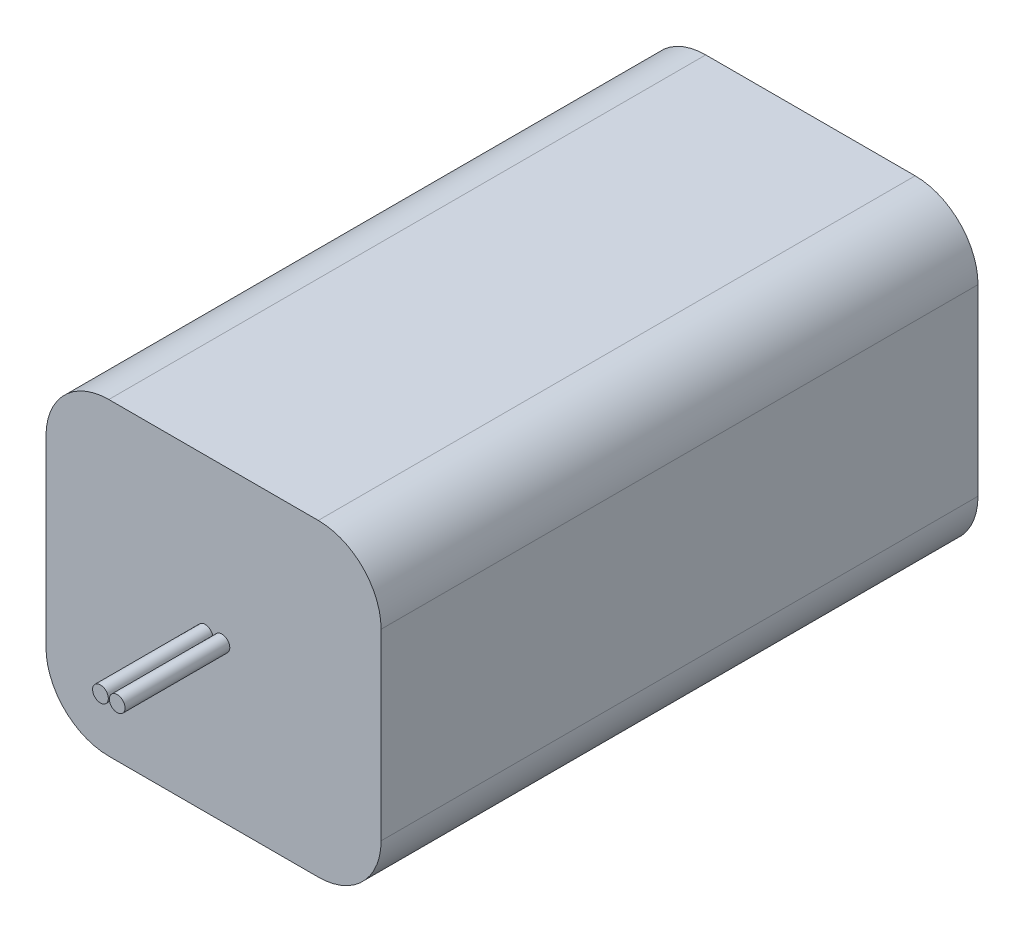
ISO-10303-21;
HEADER;
FILE_DESCRIPTION(('STEP AP214'),'2;1');
FILE_NAME('part.step','',(''),(''),'','','');
FILE_SCHEMA(('AUTOMOTIVE_DESIGN { 1 0 10303 214 1 1 1 1 }'));
ENDSEC;
DATA;
#1=APPLICATION_CONTEXT('core data for automotive mechanical design processes');
#2=APPLICATION_PROTOCOL_DEFINITION('international standard','automotive_design',2000,#1);
#3=PRODUCT_CONTEXT('',#1,'mechanical');
#4=PRODUCT('Part','Part','',(#3));
#5=PRODUCT_RELATED_PRODUCT_CATEGORY('part','',(#4));
#6=PRODUCT_DEFINITION_FORMATION('','',#4);
#7=PRODUCT_DEFINITION_CONTEXT('part definition',#1,'design');
#8=PRODUCT_DEFINITION('design','',#6,#7);
#9=PRODUCT_DEFINITION_SHAPE('','',#8);
#10=(LENGTH_UNIT() NAMED_UNIT(*) SI_UNIT(.MILLI.,.METRE.));
#11=(NAMED_UNIT(*) PLANE_ANGLE_UNIT() SI_UNIT($,.RADIAN.));
#12=(NAMED_UNIT(*) SI_UNIT($,.STERADIAN.) SOLID_ANGLE_UNIT());
#13=UNCERTAINTY_MEASURE_WITH_UNIT(LENGTH_MEASURE(1.E-05),#10,'distance_accuracy_value','');
#14=(GEOMETRIC_REPRESENTATION_CONTEXT(3) GLOBAL_UNCERTAINTY_ASSIGNED_CONTEXT((#13)) GLOBAL_UNIT_ASSIGNED_CONTEXT((#10,
#11,#12)) REPRESENTATION_CONTEXT('',''));
#15=CARTESIAN_POINT('',(0.,0.,0.));
#16=DIRECTION('',(0.,0.,1.));
#17=DIRECTION('',(1.,0.,0.));
#18=AXIS2_PLACEMENT_3D('',#15,#16,#17);
#19=CARTESIAN_POINT('',(0.8,0.,38.5));
#20=DIRECTION('',(0.,0.,-1.));
#21=DIRECTION('',(-1.,0.,0.));
#22=AXIS2_PLACEMENT_3D('',#19,#20,#21);
#23=CYLINDRICAL_SURFACE('',#22,0.75);
#24=CARTESIAN_POINT('',(0.8,0.,38.5));
#25=DIRECTION('',(0.,0.,1.));
#26=DIRECTION('',(1.,0.,0.));
#27=AXIS2_PLACEMENT_3D('',#24,#25,#26);
#28=CIRCLE('',#27,0.75);
#29=CARTESIAN_POINT('',(1.55,0.,38.5));
#30=VERTEX_POINT('',#29);
#31=EDGE_CURVE('E11',#30,#30,#28,.T.);
#32=ORIENTED_EDGE('',*,*,#31,.F.);
#33=EDGE_LOOP('',(#32));
#34=FACE_BOUND('',#33,.T.);
#35=CARTESIAN_POINT('',(0.8,0.,28.5));
#36=DIRECTION('',(0.,0.,1.));
#37=DIRECTION('',(1.,0.,0.));
#38=AXIS2_PLACEMENT_3D('',#35,#36,#37);
#39=CIRCLE('',#38,0.75);
#40=CARTESIAN_POINT('',(1.55,0.,28.5));
#41=VERTEX_POINT('',#40);
#42=EDGE_CURVE('E49',#41,#41,#39,.T.);
#43=ORIENTED_EDGE('',*,*,#42,.T.);
#44=EDGE_LOOP('',(#43));
#45=FACE_BOUND('',#44,.T.);
#46=ADVANCED_FACE('F46',(#34,#45),#23,.T.);
#47=CARTESIAN_POINT('',(0.8,0.,38.5));
#48=DIRECTION('',(0.,0.,1.));
#49=DIRECTION('',(1.,0.,0.));
#50=AXIS2_PLACEMENT_3D('',#47,#48,#49);
#51=PLANE('',#50);
#52=ORIENTED_EDGE('',*,*,#31,.T.);
#53=EDGE_LOOP('',(#52));
#54=FACE_BOUND('',#53,.T.);
#55=ADVANCED_FACE('F61',(#54),#51,.T.);
#56=CARTESIAN_POINT('',(0.8,0.,28.5));
#57=DIRECTION('',(0.,0.,1.));
#58=DIRECTION('',(1.,0.,0.));
#59=AXIS2_PLACEMENT_3D('',#56,#57,#58);
#60=PLANE('',#59);
#61=ORIENTED_EDGE('',*,*,#42,.F.);
#62=EDGE_LOOP('',(#61));
#63=FACE_BOUND('',#62,.T.);
#64=ADVANCED_FACE('F59',(#63),#60,.F.);
#65=CLOSED_SHELL('',(#46,#55,#64));
#66=MANIFOLD_SOLID_BREP('B2',#65);
#67=CARTESIAN_POINT('',(-0.8,0.,38.5));
#68=DIRECTION('',(0.,0.,-1.));
#69=DIRECTION('',(-1.,0.,0.));
#70=AXIS2_PLACEMENT_3D('',#67,#68,#69);
#71=CYLINDRICAL_SURFACE('',#70,0.75);
#72=CARTESIAN_POINT('',(-0.8,0.,38.5));
#73=DIRECTION('',(0.,0.,1.));
#74=DIRECTION('',(1.,0.,0.));
#75=AXIS2_PLACEMENT_3D('',#72,#73,#74);
#76=CIRCLE('',#75,0.75);
#77=CARTESIAN_POINT('',(-0.0499999999999999,0.,38.5));
#78=VERTEX_POINT('',#77);
#79=EDGE_CURVE('E45',#78,#78,#76,.T.);
#80=ORIENTED_EDGE('',*,*,#79,.F.);
#81=EDGE_LOOP('',(#80));
#82=FACE_BOUND('',#81,.T.);
#83=CARTESIAN_POINT('',(-0.8,0.,28.5));
#84=DIRECTION('',(0.,0.,1.));
#85=DIRECTION('',(1.,0.,0.));
#86=AXIS2_PLACEMENT_3D('',#83,#84,#85);
#87=CIRCLE('',#86,0.75);
#88=CARTESIAN_POINT('',(-0.0499999999999999,0.,28.5));
#89=VERTEX_POINT('',#88);
#90=EDGE_CURVE('E99',#89,#89,#87,.T.);
#91=ORIENTED_EDGE('',*,*,#90,.T.);
#92=EDGE_LOOP('',(#91));
#93=FACE_BOUND('',#92,.T.);
#94=ADVANCED_FACE('F96',(#82,#93),#71,.T.);
#95=CARTESIAN_POINT('',(-0.8,0.,38.5));
#96=DIRECTION('',(0.,0.,1.));
#97=DIRECTION('',(1.,0.,0.));
#98=AXIS2_PLACEMENT_3D('',#95,#96,#97);
#99=PLANE('',#98);
#100=ORIENTED_EDGE('',*,*,#79,.T.);
#101=EDGE_LOOP('',(#100));
#102=FACE_BOUND('',#101,.T.);
#103=ADVANCED_FACE('F111',(#102),#99,.T.);
#104=CARTESIAN_POINT('',(-0.8,0.,28.5));
#105=DIRECTION('',(0.,0.,1.));
#106=DIRECTION('',(1.,0.,0.));
#107=AXIS2_PLACEMENT_3D('',#104,#105,#106);
#108=PLANE('',#107);
#109=ORIENTED_EDGE('',*,*,#90,.F.);
#110=EDGE_LOOP('',(#109));
#111=FACE_BOUND('',#110,.T.);
#112=ADVANCED_FACE('F109',(#111),#108,.F.);
#113=CLOSED_SHELL('',(#94,#103,#112));
#114=MANIFOLD_SOLID_BREP('B6',#113);
#115=CARTESIAN_POINT('',(-16.,14.75,28.5));
#116=DIRECTION('',(1.,0.,0.));
#117=DIRECTION('',(0.,1.,0.));
#118=AXIS2_PLACEMENT_3D('',#115,#116,#117);
#119=PLANE('',#118);
#120=DIRECTION('',(0.,-1.,0.));
#121=VECTOR('',#120,1.);
#122=CARTESIAN_POINT('',(-16.,14.75,-28.5));
#123=LINE('',#122,#121);
#124=CARTESIAN_POINT('',(-16.,8.75,-28.5));
#125=VERTEX_POINT('',#124);
#126=CARTESIAN_POINT('',(-16.,-8.75,-28.5));
#127=VERTEX_POINT('',#126);
#128=EDGE_CURVE('E230',#125,#127,#123,.T.);
#129=ORIENTED_EDGE('',*,*,#128,.T.);
#130=DIRECTION('',(0.,0.,-1.));
#131=VECTOR('',#130,1.);
#132=CARTESIAN_POINT('',(-16.,-8.75,28.5));
#133=LINE('',#132,#131);
#134=CARTESIAN_POINT('',(-16.,-8.75,28.5));
#135=VERTEX_POINT('',#134);
#136=EDGE_CURVE('E208',#127,#135,#133,.F.);
#137=ORIENTED_EDGE('',*,*,#136,.T.);
#138=DIRECTION('',(0.,-1.,0.));
#139=VECTOR('',#138,1.);
#140=CARTESIAN_POINT('',(-16.,14.75,28.5));
#141=LINE('',#140,#139);
#142=CARTESIAN_POINT('',(-16.,8.75,28.5));
#143=VERTEX_POINT('',#142);
#144=EDGE_CURVE('E239',#143,#135,#141,.T.);
#145=ORIENTED_EDGE('',*,*,#144,.F.);
#146=DIRECTION('',(0.,0.,-1.));
#147=VECTOR('',#146,1.);
#148=CARTESIAN_POINT('',(-16.,8.75,28.5));
#149=LINE('',#148,#147);
#150=EDGE_CURVE('E213',#143,#125,#149,.T.);
#151=ORIENTED_EDGE('',*,*,#150,.T.);
#152=EDGE_LOOP('',(#129,#137,#145,#151));
#153=FACE_BOUND('',#152,.T.);
#154=ADVANCED_FACE('F137',(#153),#119,.F.);
#155=CARTESIAN_POINT('',(-16.,-14.75,28.5));
#156=DIRECTION('',(0.,1.,0.));
#157=DIRECTION('',(-1.,0.,0.));
#158=AXIS2_PLACEMENT_3D('',#155,#156,#157);
#159=PLANE('',#158);
#160=DIRECTION('',(1.,0.,0.));
#161=VECTOR('',#160,1.);
#162=CARTESIAN_POINT('',(-16.,-14.75,28.5));
#163=LINE('',#162,#161);
#164=CARTESIAN_POINT('',(-9.99999999999999,-14.75,28.5));
#165=VERTEX_POINT('',#164);
#166=CARTESIAN_POINT('',(10.,-14.75,28.5));
#167=VERTEX_POINT('',#166);
#168=EDGE_CURVE('E223',#165,#167,#163,.T.);
#169=ORIENTED_EDGE('',*,*,#168,.F.);
#170=DIRECTION('',(0.,0.,-1.));
#171=VECTOR('',#170,1.);
#172=CARTESIAN_POINT('',(-9.99999999999999,-14.75,28.5));
#173=LINE('',#172,#171);
#174=CARTESIAN_POINT('',(-9.99999999999999,-14.75,-28.5));
#175=VERTEX_POINT('',#174);
#176=EDGE_CURVE('E207',#165,#175,#173,.T.);
#177=ORIENTED_EDGE('',*,*,#176,.T.);
#178=DIRECTION('',(1.,0.,0.));
#179=VECTOR('',#178,1.);
#180=CARTESIAN_POINT('',(-16.,-14.75,-28.5));
#181=LINE('',#180,#179);
#182=CARTESIAN_POINT('',(10.,-14.75,-28.5));
#183=VERTEX_POINT('',#182);
#184=EDGE_CURVE('E220',#175,#183,#181,.T.);
#185=ORIENTED_EDGE('',*,*,#184,.T.);
#186=DIRECTION('',(0.,0.,-1.));
#187=VECTOR('',#186,1.);
#188=CARTESIAN_POINT('',(10.,-14.75,28.5));
#189=LINE('',#188,#187);
#190=EDGE_CURVE('E225',#183,#167,#189,.F.);
#191=ORIENTED_EDGE('',*,*,#190,.T.);
#192=EDGE_LOOP('',(#169,#177,#185,#191));
#193=FACE_BOUND('',#192,.T.);
#194=ADVANCED_FACE('F219',(#193),#159,.F.);
#195=CARTESIAN_POINT('',(16.,14.75,28.5));
#196=DIRECTION('',(-1.,0.,0.));
#197=DIRECTION('',(0.,-1.,0.));
#198=AXIS2_PLACEMENT_3D('',#195,#196,#197);
#199=PLANE('',#198);
#200=DIRECTION('',(0.,1.,0.));
#201=VECTOR('',#200,1.);
#202=CARTESIAN_POINT('',(16.,14.75,28.5));
#203=LINE('',#202,#201);
#204=CARTESIAN_POINT('',(16.,-8.75,28.5));
#205=VERTEX_POINT('',#204);
#206=CARTESIAN_POINT('',(16.,8.75,28.5));
#207=VERTEX_POINT('',#206);
#208=EDGE_CURVE('E265',#205,#207,#203,.T.);
#209=ORIENTED_EDGE('',*,*,#208,.F.);
#210=DIRECTION('',(0.,0.,-1.));
#211=VECTOR('',#210,1.);
#212=CARTESIAN_POINT('',(16.,-8.75,28.5));
#213=LINE('',#212,#211);
#214=CARTESIAN_POINT('',(16.,-8.75,-28.5));
#215=VERTEX_POINT('',#214);
#216=EDGE_CURVE('E258',#205,#215,#213,.T.);
#217=ORIENTED_EDGE('',*,*,#216,.T.);
#218=DIRECTION('',(0.,1.,0.));
#219=VECTOR('',#218,1.);
#220=CARTESIAN_POINT('',(16.,14.75,-28.5));
#221=LINE('',#220,#219);
#222=CARTESIAN_POINT('',(16.,8.75,-28.5));
#223=VERTEX_POINT('',#222);
#224=EDGE_CURVE('E229',#215,#223,#221,.T.);
#225=ORIENTED_EDGE('',*,*,#224,.T.);
#226=DIRECTION('',(0.,0.,-1.));
#227=VECTOR('',#226,1.);
#228=CARTESIAN_POINT('',(16.,8.75,28.5));
#229=LINE('',#228,#227);
#230=EDGE_CURVE('E256',#223,#207,#229,.F.);
#231=ORIENTED_EDGE('',*,*,#230,.T.);
#232=EDGE_LOOP('',(#209,#217,#225,#231));
#233=FACE_BOUND('',#232,.T.);
#234=ADVANCED_FACE('F263',(#233),#199,.F.);
#235=CARTESIAN_POINT('',(-16.,14.75,28.5));
#236=DIRECTION('',(0.,-1.,0.));
#237=DIRECTION('',(1.,0.,0.));
#238=AXIS2_PLACEMENT_3D('',#235,#236,#237);
#239=PLANE('',#238);
#240=DIRECTION('',(-1.,0.,0.));
#241=VECTOR('',#240,1.);
#242=CARTESIAN_POINT('',(-16.,14.75,28.5));
#243=LINE('',#242,#241);
#244=CARTESIAN_POINT('',(10.,14.75,28.5));
#245=VERTEX_POINT('',#244);
#246=CARTESIAN_POINT('',(-10.,14.75,28.5));
#247=VERTEX_POINT('',#246);
#248=EDGE_CURVE('E240',#245,#247,#243,.T.);
#249=ORIENTED_EDGE('',*,*,#248,.F.);
#250=DIRECTION('',(0.,0.,-1.));
#251=VECTOR('',#250,1.);
#252=CARTESIAN_POINT('',(10.,14.75,28.5));
#253=LINE('',#252,#251);
#254=CARTESIAN_POINT('',(10.,14.75,-28.5));
#255=VERTEX_POINT('',#254);
#256=EDGE_CURVE('E94',#245,#255,#253,.T.);
#257=ORIENTED_EDGE('',*,*,#256,.T.);
#258=DIRECTION('',(-1.,0.,0.));
#259=VECTOR('',#258,1.);
#260=CARTESIAN_POINT('',(-16.,14.75,-28.5));
#261=LINE('',#260,#259);
#262=CARTESIAN_POINT('',(-10.,14.75,-28.5));
#263=VERTEX_POINT('',#262);
#264=EDGE_CURVE('E233',#255,#263,#261,.T.);
#265=ORIENTED_EDGE('',*,*,#264,.T.);
#266=DIRECTION('',(0.,0.,-1.));
#267=VECTOR('',#266,1.);
#268=CARTESIAN_POINT('',(-10.,14.75,28.5));
#269=LINE('',#268,#267);
#270=EDGE_CURVE('E145',#263,#247,#269,.F.);
#271=ORIENTED_EDGE('',*,*,#270,.T.);
#272=EDGE_LOOP('',(#249,#257,#265,#271));
#273=FACE_BOUND('',#272,.T.);
#274=ADVANCED_FACE('F272',(#273),#239,.F.);
#275=CARTESIAN_POINT('',(0.,0.,28.5));
#276=DIRECTION('',(0.,0.,1.));
#277=DIRECTION('',(1.,0.,0.));
#278=AXIS2_PLACEMENT_3D('',#275,#276,#277);
#279=PLANE('',#278);
#280=ORIENTED_EDGE('',*,*,#144,.T.);
#281=CARTESIAN_POINT('',(-10.,-8.75,28.5));
#282=DIRECTION('',(0.,0.,1.));
#283=DIRECTION('',(1.,0.,0.));
#284=AXIS2_PLACEMENT_3D('',#281,#282,#283);
#285=CIRCLE('',#284,6.);
#286=EDGE_CURVE('E254',#135,#165,#285,.T.);
#287=ORIENTED_EDGE('',*,*,#286,.T.);
#288=ORIENTED_EDGE('',*,*,#168,.T.);
#289=CARTESIAN_POINT('',(10.,-8.75,28.5));
#290=DIRECTION('',(0.,0.,1.));
#291=DIRECTION('',(1.,0.,0.));
#292=AXIS2_PLACEMENT_3D('',#289,#290,#291);
#293=CIRCLE('',#292,6.);
#294=EDGE_CURVE('E252',#167,#205,#293,.T.);
#295=ORIENTED_EDGE('',*,*,#294,.T.);
#296=ORIENTED_EDGE('',*,*,#208,.T.);
#297=CARTESIAN_POINT('',(10.,8.75,28.5));
#298=DIRECTION('',(0.,0.,1.));
#299=DIRECTION('',(1.,0.,0.));
#300=AXIS2_PLACEMENT_3D('',#297,#298,#299);
#301=CIRCLE('',#300,6.);
#302=EDGE_CURVE('E158',#207,#245,#301,.T.);
#303=ORIENTED_EDGE('',*,*,#302,.T.);
#304=ORIENTED_EDGE('',*,*,#248,.T.);
#305=CARTESIAN_POINT('',(-10.,8.75,28.5));
#306=DIRECTION('',(0.,0.,1.));
#307=DIRECTION('',(1.,0.,0.));
#308=AXIS2_PLACEMENT_3D('',#305,#306,#307);
#309=CIRCLE('',#308,6.);
#310=EDGE_CURVE('E249',#247,#143,#309,.T.);
#311=ORIENTED_EDGE('',*,*,#310,.T.);
#312=EDGE_LOOP('',(#280,#287,#288,#295,#296,#303,#304,#311));
#313=FACE_BOUND('',#312,.T.);
#314=ADVANCED_FACE('F279',(#313),#279,.T.);
#315=CARTESIAN_POINT('',(0.,0.,-28.5));
#316=DIRECTION('',(0.,0.,1.));
#317=DIRECTION('',(1.,0.,0.));
#318=AXIS2_PLACEMENT_3D('',#315,#316,#317);
#319=PLANE('',#318);
#320=ORIENTED_EDGE('',*,*,#184,.F.);
#321=CARTESIAN_POINT('',(-10.,-8.75,-28.5));
#322=DIRECTION('',(0.,0.,1.));
#323=DIRECTION('',(1.,0.,0.));
#324=AXIS2_PLACEMENT_3D('',#321,#322,#323);
#325=CIRCLE('',#324,6.);
#326=EDGE_CURVE('E203',#175,#127,#325,.F.);
#327=ORIENTED_EDGE('',*,*,#326,.T.);
#328=ORIENTED_EDGE('',*,*,#128,.F.);
#329=CARTESIAN_POINT('',(-10.,8.75,-28.5));
#330=DIRECTION('',(0.,0.,1.));
#331=DIRECTION('',(1.,0.,0.));
#332=AXIS2_PLACEMENT_3D('',#329,#330,#331);
#333=CIRCLE('',#332,6.);
#334=EDGE_CURVE('E224',#125,#263,#333,.F.);
#335=ORIENTED_EDGE('',*,*,#334,.T.);
#336=ORIENTED_EDGE('',*,*,#264,.F.);
#337=CARTESIAN_POINT('',(10.,8.75,-28.5));
#338=DIRECTION('',(0.,0.,1.));
#339=DIRECTION('',(1.,0.,0.));
#340=AXIS2_PLACEMENT_3D('',#337,#338,#339);
#341=CIRCLE('',#340,6.);
#342=EDGE_CURVE('E243',#255,#223,#341,.F.);
#343=ORIENTED_EDGE('',*,*,#342,.T.);
#344=ORIENTED_EDGE('',*,*,#224,.F.);
#345=CARTESIAN_POINT('',(10.,-8.75,-28.5));
#346=DIRECTION('',(0.,0.,1.));
#347=DIRECTION('',(1.,0.,0.));
#348=AXIS2_PLACEMENT_3D('',#345,#346,#347);
#349=CIRCLE('',#348,6.);
#350=EDGE_CURVE('E214',#215,#183,#349,.F.);
#351=ORIENTED_EDGE('',*,*,#350,.T.);
#352=EDGE_LOOP('',(#320,#327,#328,#335,#336,#343,#344,#351));
#353=FACE_BOUND('',#352,.T.);
#354=ADVANCED_FACE('F227',(#353),#319,.F.);
#355=CARTESIAN_POINT('',(-10.,-8.75,28.5));
#356=DIRECTION('',(0.,0.,-1.));
#357=DIRECTION('',(-1.,0.,0.));
#358=AXIS2_PLACEMENT_3D('',#355,#356,#357);
#359=CYLINDRICAL_SURFACE('',#358,6.);
#360=ORIENTED_EDGE('',*,*,#286,.F.);
#361=ORIENTED_EDGE('',*,*,#136,.F.);
#362=ORIENTED_EDGE('',*,*,#326,.F.);
#363=ORIENTED_EDGE('',*,*,#176,.F.);
#364=EDGE_LOOP('',(#360,#361,#362,#363));
#365=FACE_BOUND('',#364,.T.);
#366=ADVANCED_FACE('F206',(#365),#359,.T.);
#367=CARTESIAN_POINT('',(10.,-8.75,28.5));
#368=DIRECTION('',(0.,0.,-1.));
#369=DIRECTION('',(-1.,0.,0.));
#370=AXIS2_PLACEMENT_3D('',#367,#368,#369);
#371=CYLINDRICAL_SURFACE('',#370,6.);
#372=ORIENTED_EDGE('',*,*,#294,.F.);
#373=ORIENTED_EDGE('',*,*,#190,.F.);
#374=ORIENTED_EDGE('',*,*,#350,.F.);
#375=ORIENTED_EDGE('',*,*,#216,.F.);
#376=EDGE_LOOP('',(#372,#373,#374,#375));
#377=FACE_BOUND('',#376,.T.);
#378=ADVANCED_FACE('F287',(#377),#371,.T.);
#379=CARTESIAN_POINT('',(10.,8.75,28.5));
#380=DIRECTION('',(0.,0.,-1.));
#381=DIRECTION('',(-1.,0.,0.));
#382=AXIS2_PLACEMENT_3D('',#379,#380,#381);
#383=CYLINDRICAL_SURFACE('',#382,6.);
#384=ORIENTED_EDGE('',*,*,#302,.F.);
#385=ORIENTED_EDGE('',*,*,#230,.F.);
#386=ORIENTED_EDGE('',*,*,#342,.F.);
#387=ORIENTED_EDGE('',*,*,#256,.F.);
#388=EDGE_LOOP('',(#384,#385,#386,#387));
#389=FACE_BOUND('',#388,.T.);
#390=ADVANCED_FACE('F271',(#389),#383,.T.);
#391=CARTESIAN_POINT('',(-10.,8.75,28.5));
#392=DIRECTION('',(0.,0.,-1.));
#393=DIRECTION('',(-1.,0.,0.));
#394=AXIS2_PLACEMENT_3D('',#391,#392,#393);
#395=CYLINDRICAL_SURFACE('',#394,6.);
#396=ORIENTED_EDGE('',*,*,#310,.F.);
#397=ORIENTED_EDGE('',*,*,#270,.F.);
#398=ORIENTED_EDGE('',*,*,#334,.F.);
#399=ORIENTED_EDGE('',*,*,#150,.F.);
#400=EDGE_LOOP('',(#396,#397,#398,#399));
#401=FACE_BOUND('',#400,.T.);
#402=ADVANCED_FACE('F139',(#401),#395,.T.);
#403=CLOSED_SHELL('',(#154,#194,#234,#274,#314,#354,#366,#378,#390,#402));
#404=MANIFOLD_SOLID_BREP('B40',#403);
#405=ADVANCED_BREP_SHAPE_REPRESENTATION('',(#18,#66,#114,#404),#14);
#406=SHAPE_DEFINITION_REPRESENTATION(#9,#405);
ENDSEC;
END-ISO-10303-21;
